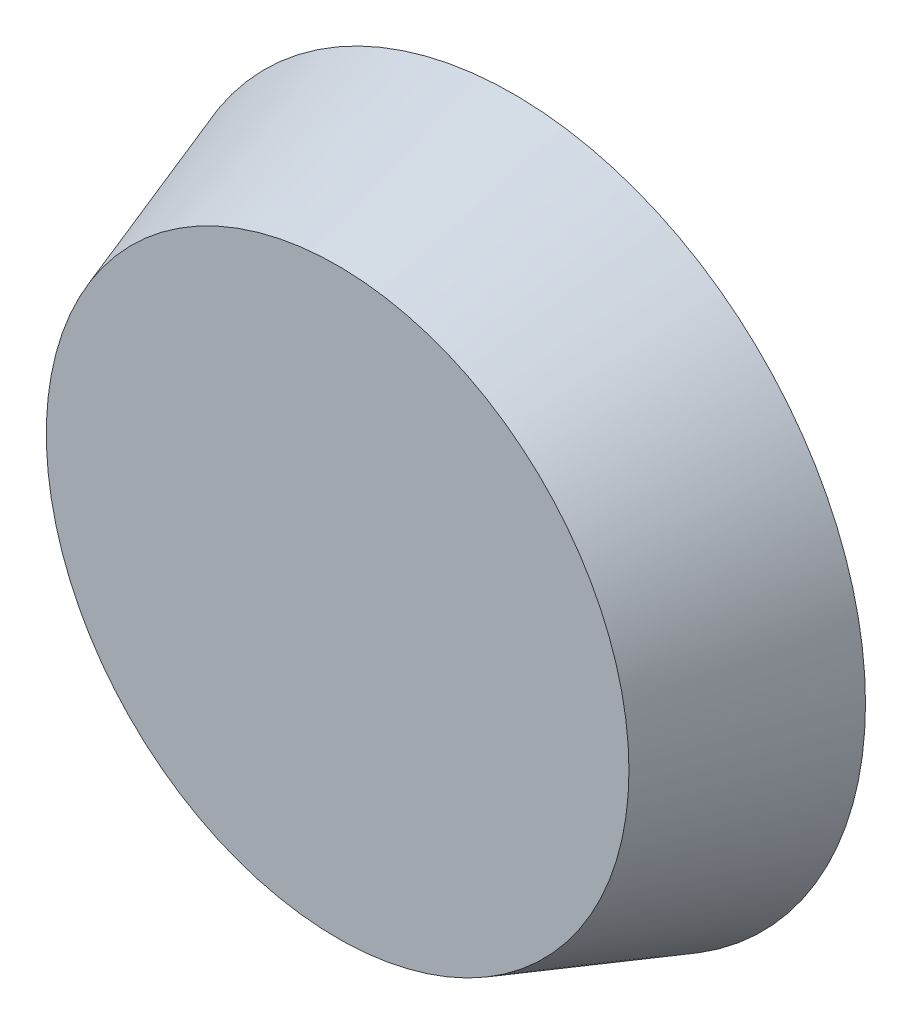
ISO-10303-21;
HEADER;
FILE_DESCRIPTION(('STEP AP214'),'2;1');
FILE_NAME('part.step','',(''),(''),'','','');
FILE_SCHEMA(('AUTOMOTIVE_DESIGN { 1 0 10303 214 1 1 1 1 }'));
ENDSEC;
DATA;
#1=APPLICATION_CONTEXT('core data for automotive mechanical design processes');
#2=APPLICATION_PROTOCOL_DEFINITION('international standard','automotive_design',2000,#1);
#3=PRODUCT_CONTEXT('',#1,'mechanical');
#4=PRODUCT('Part','Part','',(#3));
#5=PRODUCT_RELATED_PRODUCT_CATEGORY('part','',(#4));
#6=PRODUCT_DEFINITION_FORMATION('','',#4);
#7=PRODUCT_DEFINITION_CONTEXT('part definition',#1,'design');
#8=PRODUCT_DEFINITION('design','',#6,#7);
#9=PRODUCT_DEFINITION_SHAPE('','',#8);
#10=(LENGTH_UNIT() NAMED_UNIT(*) SI_UNIT(.MILLI.,.METRE.));
#11=(NAMED_UNIT(*) PLANE_ANGLE_UNIT() SI_UNIT($,.RADIAN.));
#12=(NAMED_UNIT(*) SI_UNIT($,.STERADIAN.) SOLID_ANGLE_UNIT());
#13=UNCERTAINTY_MEASURE_WITH_UNIT(LENGTH_MEASURE(1.E-05),#10,'distance_accuracy_value','');
#14=(GEOMETRIC_REPRESENTATION_CONTEXT(3) GLOBAL_UNCERTAINTY_ASSIGNED_CONTEXT((#13)) GLOBAL_UNIT_ASSIGNED_CONTEXT((#10,
#11,#12)) REPRESENTATION_CONTEXT('',''));
#15=CARTESIAN_POINT('',(0.,0.,0.));
#16=DIRECTION('',(0.,0.,1.));
#17=DIRECTION('',(1.,0.,0.));
#18=AXIS2_PLACEMENT_3D('',#15,#16,#17);
#19=CARTESIAN_POINT('',(0.,0.,0.));
#20=DIRECTION('',(0.,0.,1.));
#21=DIRECTION('',(1.,0.,0.));
#22=AXIS2_PLACEMENT_3D('',#19,#20,#21);
#23=CONICAL_SURFACE('',#22,1.,0.331612557878923);
#24=CARTESIAN_POINT('',(0.,0.,0.));
#25=DIRECTION('',(0.,0.,1.));
#26=DIRECTION('',(1.,0.,0.));
#27=AXIS2_PLACEMENT_3D('',#24,#25,#26);
#28=CIRCLE('',#27,1.);
#29=CARTESIAN_POINT('',(1.,0.,0.));
#30=VERTEX_POINT('',#29);
#31=EDGE_CURVE('E49',#30,#30,#28,.T.);
#32=ORIENTED_EDGE('',*,*,#31,.F.);
#33=EDGE_LOOP('',(#32));
#34=FACE_BOUND('',#33,.T.);
#35=CARTESIAN_POINT('',(0.,0.,0.9));
#36=DIRECTION('',(0.,0.,1.));
#37=DIRECTION('',(1.,0.,0.));
#38=AXIS2_PLACEMENT_3D('',#35,#36,#37);
#39=CIRCLE('',#38,1.3098948519607);
#40=CARTESIAN_POINT('',(1.3098948519607,0.,0.9));
#41=VERTEX_POINT('',#40);
#42=EDGE_CURVE('E41',#41,#41,#39,.T.);
#43=ORIENTED_EDGE('',*,*,#42,.T.);
#44=EDGE_LOOP('',(#43));
#45=FACE_BOUND('',#44,.T.);
#46=ADVANCED_FACE('F38',(#34,#45),#23,.F.);
#47=CARTESIAN_POINT('',(0.,0.,1.));
#48=DIRECTION('',(0.,0.,1.));
#49=DIRECTION('',(1.,0.,0.));
#50=AXIS2_PLACEMENT_3D('',#47,#48,#49);
#51=PLANE('',#50);
#52=CARTESIAN_POINT('',(0.,0.,1.));
#53=DIRECTION('',(0.,0.,1.));
#54=DIRECTION('',(1.,0.,0.));
#55=AXIS2_PLACEMENT_3D('',#52,#53,#54);
#56=CIRCLE('',#55,1.65567238671033);
#57=CARTESIAN_POINT('',(1.65567238671033,0.,1.));
#58=VERTEX_POINT('',#57);
#59=EDGE_CURVE('E11',#58,#58,#56,.T.);
#60=ORIENTED_EDGE('',*,*,#59,.T.);
#61=EDGE_LOOP('',(#60));
#62=FACE_BOUND('',#61,.T.);
#63=ADVANCED_FACE('F70',(#62),#51,.T.);
#64=CARTESIAN_POINT('',(0.,0.,0.));
#65=DIRECTION('',(0.,0.,1.));
#66=DIRECTION('',(1.,0.,0.));
#67=AXIS2_PLACEMENT_3D('',#64,#65,#66);
#68=PLANE('',#67);
#69=CARTESIAN_POINT('',(0.,0.,0.));
#70=DIRECTION('',(0.,0.,1.));
#71=DIRECTION('',(1.,0.,0.));
#72=AXIS2_PLACEMENT_3D('',#69,#70,#71);
#73=CIRCLE('',#72,2.);
#74=CARTESIAN_POINT('',(2.,0.,0.));
#75=VERTEX_POINT('',#74);
#76=EDGE_CURVE('E45',#75,#75,#73,.T.);
#77=ORIENTED_EDGE('',*,*,#76,.F.);
#78=EDGE_LOOP('',(#77));
#79=FACE_BOUND('',#78,.T.);
#80=ORIENTED_EDGE('',*,*,#31,.T.);
#81=EDGE_LOOP('',(#80));
#82=FACE_BOUND('',#81,.T.);
#83=ADVANCED_FACE('F66',(#79,#82),#68,.F.);
#84=CARTESIAN_POINT('',(0.,0.,0.));
#85=DIRECTION('',(0.,0.,-1.));
#86=DIRECTION('',(1.,0.,0.));
#87=AXIS2_PLACEMENT_3D('',#84,#85,#86);
#88=CONICAL_SURFACE('',#87,2.,0.331612557878923);
#89=ORIENTED_EDGE('',*,*,#59,.F.);
#90=EDGE_LOOP('',(#89));
#91=FACE_BOUND('',#90,.T.);
#92=ORIENTED_EDGE('',*,*,#76,.T.);
#93=EDGE_LOOP('',(#92));
#94=FACE_BOUND('',#93,.T.);
#95=ADVANCED_FACE('F61',(#91,#94),#88,.T.);
#96=CARTESIAN_POINT('',(0.,0.,0.9));
#97=DIRECTION('',(0.,0.,1.));
#98=DIRECTION('',(1.,0.,0.));
#99=AXIS2_PLACEMENT_3D('',#96,#97,#98);
#100=PLANE('',#99);
#101=ORIENTED_EDGE('',*,*,#42,.F.);
#102=EDGE_LOOP('',(#101));
#103=FACE_BOUND('',#102,.T.);
#104=ADVANCED_FACE('F59',(#103),#100,.F.);
#105=CLOSED_SHELL('',(#46,#63,#83,#95,#104));
#106=MANIFOLD_SOLID_BREP('B2',#105);
#107=ADVANCED_BREP_SHAPE_REPRESENTATION('',(#18,#106),#14);
#108=SHAPE_DEFINITION_REPRESENTATION(#9,#107);
ENDSEC;
END-ISO-10303-21;
